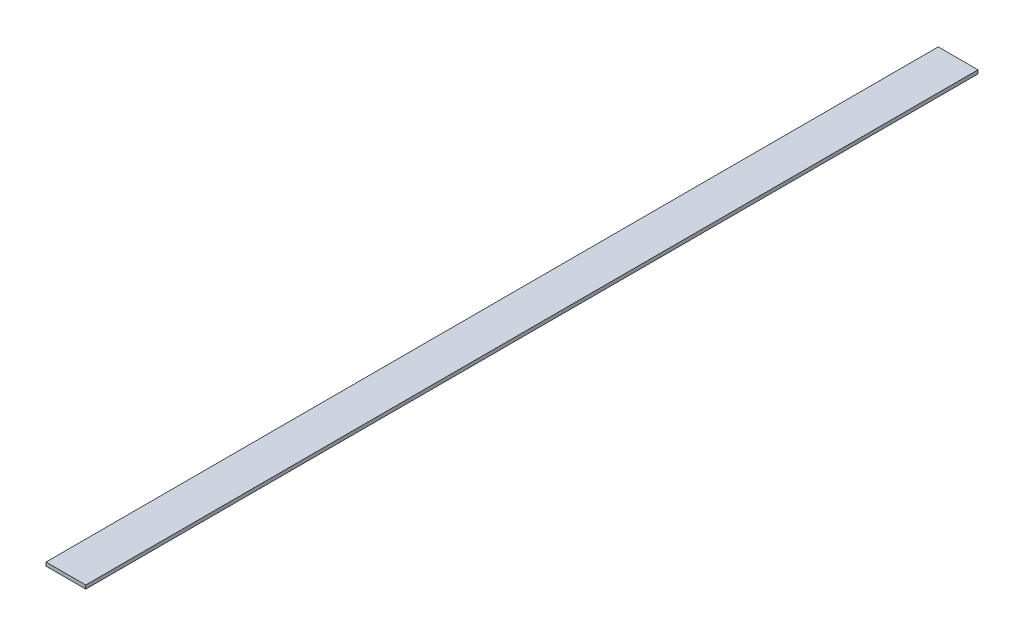
ISO-10303-21;
HEADER;
FILE_DESCRIPTION(('STEP AP214'),'2;1');
FILE_NAME('part.step','',(''),(''),'','','');
FILE_SCHEMA(('AUTOMOTIVE_DESIGN { 1 0 10303 214 1 1 1 1 }'));
ENDSEC;
DATA;
#1=APPLICATION_CONTEXT('core data for automotive mechanical design processes');
#2=APPLICATION_PROTOCOL_DEFINITION('international standard','automotive_design',2000,#1);
#3=PRODUCT_CONTEXT('',#1,'mechanical');
#4=PRODUCT('Part','Part','',(#3));
#5=PRODUCT_RELATED_PRODUCT_CATEGORY('part','',(#4));
#6=PRODUCT_DEFINITION_FORMATION('','',#4);
#7=PRODUCT_DEFINITION_CONTEXT('part definition',#1,'design');
#8=PRODUCT_DEFINITION('design','',#6,#7);
#9=PRODUCT_DEFINITION_SHAPE('','',#8);
#10=(LENGTH_UNIT() NAMED_UNIT(*) SI_UNIT(.MILLI.,.METRE.));
#11=(NAMED_UNIT(*) PLANE_ANGLE_UNIT() SI_UNIT($,.RADIAN.));
#12=(NAMED_UNIT(*) SI_UNIT($,.STERADIAN.) SOLID_ANGLE_UNIT());
#13=UNCERTAINTY_MEASURE_WITH_UNIT(LENGTH_MEASURE(1.E-05),#10,'distance_accuracy_value','');
#14=(GEOMETRIC_REPRESENTATION_CONTEXT(3) GLOBAL_UNCERTAINTY_ASSIGNED_CONTEXT((#13)) GLOBAL_UNIT_ASSIGNED_CONTEXT((#10,
#11,#12)) REPRESENTATION_CONTEXT('',''));
#15=CARTESIAN_POINT('',(0.,0.,0.));
#16=DIRECTION('',(0.,0.,1.));
#17=DIRECTION('',(1.,0.,0.));
#18=AXIS2_PLACEMENT_3D('',#15,#16,#17);
#19=CARTESIAN_POINT('',(0.,0.,2470.));
#20=DIRECTION('',(1.,0.,0.));
#21=DIRECTION('',(0.,0.,-1.));
#22=AXIS2_PLACEMENT_3D('',#19,#20,#21);
#23=PLANE('',#22);
#24=DIRECTION('',(0.,-1.,0.));
#25=VECTOR('',#24,1.);
#26=CARTESIAN_POINT('',(0.,0.,0.));
#27=LINE('',#26,#25);
#28=CARTESIAN_POINT('',(0.,0.,0.));
#29=VERTEX_POINT('',#28);
#30=CARTESIAN_POINT('',(0.,-10.,0.));
#31=VERTEX_POINT('',#30);
#32=EDGE_CURVE('E96',#29,#31,#27,.T.);
#33=ORIENTED_EDGE('',*,*,#32,.T.);
#34=DIRECTION('',(0.,0.,-1.));
#35=VECTOR('',#34,1.);
#36=CARTESIAN_POINT('',(0.,-10.,2470.));
#37=LINE('',#36,#35);
#38=CARTESIAN_POINT('',(0.,-10.,2470.));
#39=VERTEX_POINT('',#38);
#40=EDGE_CURVE('E11',#39,#31,#37,.T.);
#41=ORIENTED_EDGE('',*,*,#40,.F.);
#42=DIRECTION('',(0.,-1.,0.));
#43=VECTOR('',#42,1.);
#44=CARTESIAN_POINT('',(0.,0.,2470.));
#45=LINE('',#44,#43);
#46=CARTESIAN_POINT('',(0.,0.,2470.));
#47=VERTEX_POINT('',#46);
#48=EDGE_CURVE('E84',#47,#39,#45,.T.);
#49=ORIENTED_EDGE('',*,*,#48,.F.);
#50=DIRECTION('',(0.,0.,-1.));
#51=VECTOR('',#50,1.);
#52=CARTESIAN_POINT('',(0.,0.,2470.));
#53=LINE('',#52,#51);
#54=EDGE_CURVE('E92',#47,#29,#53,.T.);
#55=ORIENTED_EDGE('',*,*,#54,.T.);
#56=EDGE_LOOP('',(#33,#41,#49,#55));
#57=FACE_BOUND('',#56,.T.);
#58=ADVANCED_FACE('F33',(#57),#23,.F.);
#59=CARTESIAN_POINT('',(0.,-10.,2470.));
#60=DIRECTION('',(0.,1.,0.));
#61=DIRECTION('',(0.,0.,1.));
#62=AXIS2_PLACEMENT_3D('',#59,#60,#61);
#63=PLANE('',#62);
#64=DIRECTION('',(1.,0.,0.));
#65=VECTOR('',#64,1.);
#66=CARTESIAN_POINT('',(0.,-10.,0.));
#67=LINE('',#66,#65);
#68=CARTESIAN_POINT('',(110.,-10.,0.));
#69=VERTEX_POINT('',#68);
#70=EDGE_CURVE('E88',#31,#69,#67,.T.);
#71=ORIENTED_EDGE('',*,*,#70,.T.);
#72=DIRECTION('',(0.,0.,-1.));
#73=VECTOR('',#72,1.);
#74=CARTESIAN_POINT('',(110.,-10.,2470.));
#75=LINE('',#74,#73);
#76=CARTESIAN_POINT('',(110.,-10.,2470.));
#77=VERTEX_POINT('',#76);
#78=EDGE_CURVE('E41',#77,#69,#75,.T.);
#79=ORIENTED_EDGE('',*,*,#78,.F.);
#80=DIRECTION('',(1.,0.,0.));
#81=VECTOR('',#80,1.);
#82=CARTESIAN_POINT('',(0.,-10.,2470.));
#83=LINE('',#82,#81);
#84=EDGE_CURVE('E79',#39,#77,#83,.T.);
#85=ORIENTED_EDGE('',*,*,#84,.F.);
#86=ORIENTED_EDGE('',*,*,#40,.T.);
#87=EDGE_LOOP('',(#71,#79,#85,#86));
#88=FACE_BOUND('',#87,.T.);
#89=ADVANCED_FACE('F87',(#88),#63,.F.);
#90=CARTESIAN_POINT('',(110.,0.,2470.));
#91=DIRECTION('',(-1.,0.,0.));
#92=DIRECTION('',(0.,0.,1.));
#93=AXIS2_PLACEMENT_3D('',#90,#91,#92);
#94=PLANE('',#93);
#95=DIRECTION('',(0.,1.,0.));
#96=VECTOR('',#95,1.);
#97=CARTESIAN_POINT('',(110.,0.,0.));
#98=LINE('',#97,#96);
#99=CARTESIAN_POINT('',(110.,0.,0.));
#100=VERTEX_POINT('',#99);
#101=EDGE_CURVE('E66',#69,#100,#98,.T.);
#102=ORIENTED_EDGE('',*,*,#101,.T.);
#103=DIRECTION('',(0.,0.,-1.));
#104=VECTOR('',#103,1.);
#105=CARTESIAN_POINT('',(110.,0.,2470.));
#106=LINE('',#105,#104);
#107=CARTESIAN_POINT('',(110.,0.,2470.));
#108=VERTEX_POINT('',#107);
#109=EDGE_CURVE('E89',#108,#100,#106,.T.);
#110=ORIENTED_EDGE('',*,*,#109,.F.);
#111=DIRECTION('',(0.,1.,0.));
#112=VECTOR('',#111,1.);
#113=CARTESIAN_POINT('',(110.,0.,2470.));
#114=LINE('',#113,#112);
#115=EDGE_CURVE('E82',#77,#108,#114,.T.);
#116=ORIENTED_EDGE('',*,*,#115,.F.);
#117=ORIENTED_EDGE('',*,*,#78,.T.);
#118=EDGE_LOOP('',(#102,#110,#116,#117));
#119=FACE_BOUND('',#118,.T.);
#120=ADVANCED_FACE('F90',(#119),#94,.F.);
#121=CARTESIAN_POINT('',(0.,0.,2470.));
#122=DIRECTION('',(0.,-1.,0.));
#123=DIRECTION('',(0.,0.,-1.));
#124=AXIS2_PLACEMENT_3D('',#121,#122,#123);
#125=PLANE('',#124);
#126=DIRECTION('',(-1.,0.,0.));
#127=VECTOR('',#126,1.);
#128=CARTESIAN_POINT('',(0.,0.,0.));
#129=LINE('',#128,#127);
#130=EDGE_CURVE('E72',#100,#29,#129,.T.);
#131=ORIENTED_EDGE('',*,*,#130,.T.);
#132=ORIENTED_EDGE('',*,*,#54,.F.);
#133=DIRECTION('',(-1.,0.,0.));
#134=VECTOR('',#133,1.);
#135=CARTESIAN_POINT('',(0.,0.,2470.));
#136=LINE('',#135,#134);
#137=EDGE_CURVE('E49',#108,#47,#136,.T.);
#138=ORIENTED_EDGE('',*,*,#137,.F.);
#139=ORIENTED_EDGE('',*,*,#109,.T.);
#140=EDGE_LOOP('',(#131,#132,#138,#139));
#141=FACE_BOUND('',#140,.T.);
#142=ADVANCED_FACE('F103',(#141),#125,.F.);
#143=CARTESIAN_POINT('',(0.,0.,2470.));
#144=DIRECTION('',(0.,0.,1.));
#145=DIRECTION('',(1.,0.,0.));
#146=AXIS2_PLACEMENT_3D('',#143,#144,#145);
#147=PLANE('',#146);
#148=ORIENTED_EDGE('',*,*,#48,.T.);
#149=ORIENTED_EDGE('',*,*,#84,.T.);
#150=ORIENTED_EDGE('',*,*,#115,.T.);
#151=ORIENTED_EDGE('',*,*,#137,.T.);
#152=EDGE_LOOP('',(#148,#149,#150,#151));
#153=FACE_BOUND('',#152,.T.);
#154=ADVANCED_FACE('F80',(#153),#147,.T.);
#155=CARTESIAN_POINT('',(0.,0.,0.));
#156=DIRECTION('',(0.,0.,1.));
#157=DIRECTION('',(1.,0.,0.));
#158=AXIS2_PLACEMENT_3D('',#155,#156,#157);
#159=PLANE('',#158);
#160=ORIENTED_EDGE('',*,*,#32,.F.);
#161=ORIENTED_EDGE('',*,*,#130,.F.);
#162=ORIENTED_EDGE('',*,*,#101,.F.);
#163=ORIENTED_EDGE('',*,*,#70,.F.);
#164=EDGE_LOOP('',(#160,#161,#162,#163));
#165=FACE_BOUND('',#164,.T.);
#166=ADVANCED_FACE('F106',(#165),#159,.F.);
#167=CLOSED_SHELL('',(#58,#89,#120,#142,#154,#166));
#168=MANIFOLD_SOLID_BREP('B2',#167);
#169=ADVANCED_BREP_SHAPE_REPRESENTATION('',(#18,#168),#14);
#170=SHAPE_DEFINITION_REPRESENTATION(#9,#169);
ENDSEC;
END-ISO-10303-21;
